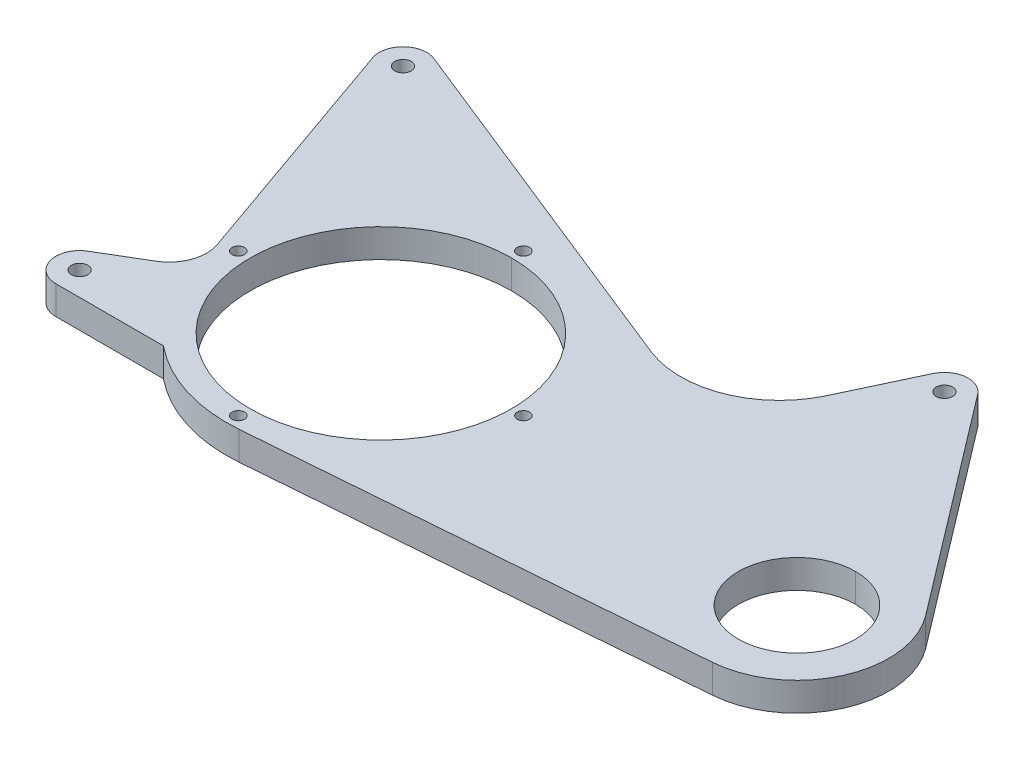
ISO-10303-21;
HEADER;
FILE_DESCRIPTION(('STEP AP214'),'2;1');
FILE_NAME('part.step','',(''),(''),'','','');
FILE_SCHEMA(('AUTOMOTIVE_DESIGN { 1 0 10303 214 1 1 1 1 }'));
ENDSEC;
DATA;
#1=APPLICATION_CONTEXT('core data for automotive mechanical design processes');
#2=APPLICATION_PROTOCOL_DEFINITION('international standard','automotive_design',2000,#1);
#3=PRODUCT_CONTEXT('',#1,'mechanical');
#4=PRODUCT('Part','Part','',(#3));
#5=PRODUCT_RELATED_PRODUCT_CATEGORY('part','',(#4));
#6=PRODUCT_DEFINITION_FORMATION('','',#4);
#7=PRODUCT_DEFINITION_CONTEXT('part definition',#1,'design');
#8=PRODUCT_DEFINITION('design','',#6,#7);
#9=PRODUCT_DEFINITION_SHAPE('','',#8);
#10=(LENGTH_UNIT() NAMED_UNIT(*) SI_UNIT(.MILLI.,.METRE.));
#11=(NAMED_UNIT(*) PLANE_ANGLE_UNIT() SI_UNIT($,.RADIAN.));
#12=(NAMED_UNIT(*) SI_UNIT($,.STERADIAN.) SOLID_ANGLE_UNIT());
#13=UNCERTAINTY_MEASURE_WITH_UNIT(LENGTH_MEASURE(1.E-05),#10,'distance_accuracy_value','');
#14=(GEOMETRIC_REPRESENTATION_CONTEXT(3) GLOBAL_UNCERTAINTY_ASSIGNED_CONTEXT((#13)) GLOBAL_UNIT_ASSIGNED_CONTEXT((#10,
#11,#12)) REPRESENTATION_CONTEXT('',''));
#15=CARTESIAN_POINT('',(0.,0.,0.));
#16=DIRECTION('',(0.,0.,1.));
#17=DIRECTION('',(1.,0.,0.));
#18=AXIS2_PLACEMENT_3D('',#15,#16,#17);
#19=CARTESIAN_POINT('',(54.6099999999999,11.43,127.));
#20=DIRECTION('',(0.,-1.,0.));
#21=DIRECTION('',(0.,0.,-1.));
#22=AXIS2_PLACEMENT_3D('',#19,#20,#21);
#23=CYLINDRICAL_SURFACE('',#22,23.5);
#24=CARTESIAN_POINT('',(54.6099999999999,11.43,127.));
#25=DIRECTION('',(0.,1.,0.));
#26=DIRECTION('',(0.,0.,1.));
#27=AXIS2_PLACEMENT_3D('',#24,#25,#26);
#28=CIRCLE('',#27,23.5);
#29=CARTESIAN_POINT('',(54.6099999999999,11.43,103.5));
#30=VERTEX_POINT('',#29);
#31=CARTESIAN_POINT('',(54.6099999999999,11.43,150.5));
#32=VERTEX_POINT('',#31);
#33=EDGE_CURVE('E205',#30,#32,#28,.T.);
#34=ORIENTED_EDGE('',*,*,#33,.T.);
#35=DIRECTION('',(0.,-1.,0.));
#36=VECTOR('',#35,1.);
#37=CARTESIAN_POINT('',(54.6099999999999,11.43,150.5));
#38=LINE('',#37,#36);
#39=CARTESIAN_POINT('',(54.6099999999999,0.,150.5));
#40=VERTEX_POINT('',#39);
#41=EDGE_CURVE('E11',#32,#40,#38,.T.);
#42=ORIENTED_EDGE('',*,*,#41,.T.);
#43=CARTESIAN_POINT('',(54.6099999999999,0.,127.));
#44=DIRECTION('',(0.,1.,0.));
#45=DIRECTION('',(0.,0.,1.));
#46=AXIS2_PLACEMENT_3D('',#43,#44,#45);
#47=CIRCLE('',#46,23.5);
#48=CARTESIAN_POINT('',(54.6099999999999,0.,103.5));
#49=VERTEX_POINT('',#48);
#50=EDGE_CURVE('E207',#49,#40,#47,.T.);
#51=ORIENTED_EDGE('',*,*,#50,.F.);
#52=DIRECTION('',(0.,1.,0.));
#53=VECTOR('',#52,1.);
#54=CARTESIAN_POINT('',(54.6099999999999,11.43,103.5));
#55=LINE('',#54,#53);
#56=EDGE_CURVE('E49',#49,#30,#55,.T.);
#57=ORIENTED_EDGE('',*,*,#56,.T.);
#58=EDGE_LOOP('',(#34,#42,#51,#57));
#59=FACE_BOUND('',#58,.T.);
#60=ADVANCED_FACE('F40',(#59),#23,.F.);
#61=CARTESIAN_POINT('',(-123.19,11.43,116.001477371938));
#62=DIRECTION('',(0.,-1.,0.));
#63=DIRECTION('',(0.,0.,-1.));
#64=AXIS2_PLACEMENT_3D('',#61,#62,#63);
#65=CYLINDRICAL_SURFACE('',#64,52.3875);
#66=CARTESIAN_POINT('',(-123.19,11.43,116.001477371938));
#67=DIRECTION('',(0.,1.,0.));
#68=DIRECTION('',(0.,0.,1.));
#69=AXIS2_PLACEMENT_3D('',#66,#67,#68);
#70=CIRCLE('',#69,52.3875);
#71=CARTESIAN_POINT('',(-123.19,11.43,63.6139773719377));
#72=VERTEX_POINT('',#71);
#73=CARTESIAN_POINT('',(-123.19,11.43,168.388977371938));
#74=VERTEX_POINT('',#73);
#75=EDGE_CURVE('E220',#72,#74,#70,.T.);
#76=ORIENTED_EDGE('',*,*,#75,.T.);
#77=DIRECTION('',(0.,-1.,0.));
#78=VECTOR('',#77,1.);
#79=CARTESIAN_POINT('',(-123.19,11.43,168.388977371938));
#80=LINE('',#79,#78);
#81=CARTESIAN_POINT('',(-123.19,0.,168.388977371938));
#82=VERTEX_POINT('',#81);
#83=EDGE_CURVE('E192',#74,#82,#80,.T.);
#84=ORIENTED_EDGE('',*,*,#83,.T.);
#85=CARTESIAN_POINT('',(-123.19,0.,116.001477371938));
#86=DIRECTION('',(0.,1.,0.));
#87=DIRECTION('',(0.,0.,1.));
#88=AXIS2_PLACEMENT_3D('',#85,#86,#87);
#89=CIRCLE('',#88,52.3875);
#90=CARTESIAN_POINT('',(-123.19,0.,63.6139773719377));
#91=VERTEX_POINT('',#90);
#92=EDGE_CURVE('E212',#91,#82,#89,.T.);
#93=ORIENTED_EDGE('',*,*,#92,.F.);
#94=DIRECTION('',(0.,1.,0.));
#95=VECTOR('',#94,1.);
#96=CARTESIAN_POINT('',(-123.19,11.43,63.6139773719377));
#97=LINE('',#96,#95);
#98=EDGE_CURVE('E188',#91,#72,#97,.T.);
#99=ORIENTED_EDGE('',*,*,#98,.T.);
#100=EDGE_LOOP('',(#76,#84,#93,#99));
#101=FACE_BOUND('',#100,.T.);
#102=ADVANCED_FACE('F338',(#101),#65,.F.);
#103=CARTESIAN_POINT('',(-205.575185514482,11.43,154.375359311032));
#104=DIRECTION('',(0.,1.,0.));
#105=DIRECTION('',(0.,0.,1.));
#106=AXIS2_PLACEMENT_3D('',#103,#104,#105);
#107=PLANE('',#106);
#108=CARTESIAN_POINT('',(-66.04,11.43,116.001477371938));
#109=DIRECTION('',(0.,-1.,0.));
#110=DIRECTION('',(0.,0.,-1.));
#111=AXIS2_PLACEMENT_3D('',#108,#109,#110);
#112=CIRCLE('',#111,2.5);
#113=CARTESIAN_POINT('',(-66.04,11.43,113.501477371938));
#114=VERTEX_POINT('',#113);
#115=EDGE_CURVE('E601',#114,#114,#112,.T.);
#116=ORIENTED_EDGE('',*,*,#115,.T.);
#117=EDGE_LOOP('',(#116));
#118=FACE_BOUND('',#117,.T.);
#119=ORIENTED_EDGE('',*,*,#33,.F.);
#120=EDGE_CURVE('E209',#32,#30,#28,.T.);
#121=ORIENTED_EDGE('',*,*,#120,.F.);
#122=EDGE_LOOP('',(#119,#121));
#123=FACE_BOUND('',#122,.T.);
#124=CARTESIAN_POINT('',(-205.575185514482,11.43,154.375359311032));
#125=DIRECTION('',(0.,1.,0.));
#126=DIRECTION('',(0.,0.,1.));
#127=AXIS2_PLACEMENT_3D('',#124,#125,#126);
#128=CIRCLE('',#127,9.52500000000005);
#129=CARTESIAN_POINT('',(-210.444169905688,11.43,146.188869465061));
#130=VERTEX_POINT('',#129);
#131=CARTESIAN_POINT('',(-205.575185514482,11.43,163.900359311032));
#132=VERTEX_POINT('',#131);
#133=EDGE_CURVE('E174',#130,#132,#128,.T.);
#134=ORIENTED_EDGE('',*,*,#133,.T.);
#135=DIRECTION('',(1.,0.,0.));
#136=VECTOR('',#135,1.);
#137=CARTESIAN_POINT('',(-205.575185514482,11.43,163.900359311032));
#138=LINE('',#137,#136);
#139=CARTESIAN_POINT('',(-162.418239384845,11.43,163.900359311032));
#140=VERTEX_POINT('',#139);
#141=EDGE_CURVE('E163',#132,#140,#138,.T.);
#142=ORIENTED_EDGE('',*,*,#141,.T.);
#143=CARTESIAN_POINT('',(-123.19,11.43,116.001477371937));
#144=DIRECTION('',(0.,1.,0.));
#145=DIRECTION('',(0.,0.,1.));
#146=AXIS2_PLACEMENT_3D('',#143,#144,#145);
#147=CIRCLE('',#146,61.912500000001);
#148=CARTESIAN_POINT('',(-118.273664056399,11.43,177.718470956684));
#149=VERTEX_POINT('',#148);
#150=EDGE_CURVE('E173',#140,#149,#147,.T.);
#151=ORIENTED_EDGE('',*,*,#150,.T.);
#152=DIRECTION('',(0.996842214169137,0.,-0.0794078084974861));
#153=VECTOR('',#152,1.);
#154=CARTESIAN_POINT('',(-118.273664056399,11.43,177.718470956684));
#155=LINE('',#154,#153);
#156=CARTESIAN_POINT('',(57.5345895869624,11.43,163.713698747849));
#157=VERTEX_POINT('',#156);
#158=EDGE_CURVE('E226',#149,#157,#155,.T.);
#159=ORIENTED_EDGE('',*,*,#158,.T.);
#160=CARTESIAN_POINT('',(54.6099999999999,11.43,127.));
#161=DIRECTION('',(0.,1.,0.));
#162=DIRECTION('',(0.,0.,1.));
#163=AXIS2_PLACEMENT_3D('',#160,#161,#162);
#164=CIRCLE('',#163,36.83);
#165=CARTESIAN_POINT('',(83.9187029811116,11.43,104.696439083299));
#166=VERTEX_POINT('',#165);
#167=EDGE_CURVE('E228',#157,#166,#164,.T.);
#168=ORIENTED_EDGE('',*,*,#167,.T.);
#169=DIRECTION('',(-0.605581344466488,0.,-0.795783409750518));
#170=VECTOR('',#169,1.);
#171=CARTESIAN_POINT('',(17.6135418446228,11.43,17.5660350584896));
#172=LINE('',#171,#170);
#173=CARTESIAN_POINT('',(17.6135418446228,11.43,17.5660350584896));
#174=VERTEX_POINT('',#173);
#175=EDGE_CURVE('E230',#166,#174,#172,.T.);
#176=ORIENTED_EDGE('',*,*,#175,.T.);
#177=CARTESIAN_POINT('',(10.0337048667491,11.43,23.3341973645329));
#178=DIRECTION('',(0.,1.,0.));
#179=DIRECTION('',(0.,0.,-1.));
#180=AXIS2_PLACEMENT_3D('',#177,#178,#179);
#181=CIRCLE('',#180,9.52500000000002);
#182=CARTESIAN_POINT('',(1.41255824520431,11.43,19.2843262641365));
#183=VERTEX_POINT('',#182);
#184=EDGE_CURVE('E232',#174,#183,#181,.T.);
#185=ORIENTED_EDGE('',*,*,#184,.T.);
#186=DIRECTION('',(-0.42518331762692,0.,0.905107256855101));
#187=VECTOR('',#186,1.);
#188=CARTESIAN_POINT('',(1.41255824520431,11.43,19.2843262641365));
#189=LINE('',#188,#187);
#190=CARTESIAN_POINT('',(-12.1766039892332,11.43,48.2122000612996));
#191=VERTEX_POINT('',#190);
#192=EDGE_CURVE('E234',#183,#191,#189,.T.);
#193=ORIENTED_EDGE('',*,*,#192,.T.);
#194=CARTESIAN_POINT('',(-48.0405739348598,11.43,31.3647362836502));
#195=DIRECTION('',(0.,-1.,0.));
#196=DIRECTION('',(0.,0.,-1.));
#197=AXIS2_PLACEMENT_3D('',#194,#195,#196);
#198=CIRCLE('',#197,39.6240000000003);
#199=CARTESIAN_POINT('',(-62.7807065141295,11.43,68.1450281197079));
#200=VERTEX_POINT('',#199);
#201=EDGE_CURVE('E236',#191,#200,#198,.T.);
#202=ORIENTED_EDGE('',*,*,#201,.T.);
#203=DIRECTION('',(-0.928232683122789,0.,-0.372000115568084));
#204=VECTOR('',#203,1.);
#205=CARTESIAN_POINT('',(-207.97488178539,11.43,9.95676243721548));
#206=LINE('',#205,#204);
#207=CARTESIAN_POINT('',(-207.97488178539,11.43,9.9567624372155));
#208=VERTEX_POINT('',#207);
#209=EDGE_CURVE('E238',#200,#208,#206,.T.);
#210=ORIENTED_EDGE('',*,*,#209,.T.);
#211=CARTESIAN_POINT('',(-211.518182886176,11.43,18.7981787439601));
#212=DIRECTION('',(0.,1.,0.));
#213=DIRECTION('',(0.,0.,-1.));
#214=AXIS2_PLACEMENT_3D('',#211,#212,#213);
#215=CIRCLE('',#214,9.52500000000002);
#216=CARTESIAN_POINT('',(-220.505862299566,11.43,21.9521038797442));
#217=VERTEX_POINT('',#216);
#218=EDGE_CURVE('E240',#208,#217,#215,.T.);
#219=ORIENTED_EDGE('',*,*,#218,.T.);
#220=DIRECTION('',(0.331120749163686,0.,0.943588389857187));
#221=VECTOR('',#220,1.);
#222=CARTESIAN_POINT('',(-220.505862299566,11.43,21.9521038797442));
#223=LINE('',#222,#221);
#224=CARTESIAN_POINT('',(-186.782347933203,11.43,118.053350031344));
#225=VERTEX_POINT('',#224);
#226=EDGE_CURVE('E242',#217,#225,#223,.T.);
#227=ORIENTED_EDGE('',*,*,#226,.T.);
#228=CARTESIAN_POINT('',(-200.998052664187,11.43,123.041875590805));
#229=DIRECTION('',(0.,-1.,0.));
#230=DIRECTION('',(0.,0.,1.));
#231=AXIS2_PLACEMENT_3D('',#228,#229,#230);
#232=CIRCLE('',#231,15.0655782582648);
#233=CARTESIAN_POINT('',(-193.296838450644,11.43,135.990348392376));
#234=VERTEX_POINT('',#233);
#235=EDGE_CURVE('E244',#225,#234,#232,.T.);
#236=ORIENTED_EDGE('',*,*,#235,.T.);
#237=DIRECTION('',(-0.859473999577012,0.,0.511179463643732));
#238=VECTOR('',#237,1.);
#239=CARTESIAN_POINT('',(-210.444169905688,11.43,146.188869465061));
#240=LINE('',#239,#238);
#241=EDGE_CURVE('E180',#234,#130,#240,.T.);
#242=ORIENTED_EDGE('',*,*,#241,.T.);
#243=EDGE_LOOP('',(#134,#142,#151,#159,#168,#176,#185,#193,#202,#210,#219,#227,#236,#242));
#244=FACE_BOUND('',#243,.T.);
#245=ORIENTED_EDGE('',*,*,#75,.F.);
#246=EDGE_CURVE('E222',#74,#72,#70,.T.);
#247=ORIENTED_EDGE('',*,*,#246,.F.);
#248=EDGE_LOOP('',(#245,#247));
#249=FACE_BOUND('',#248,.T.);
#250=CARTESIAN_POINT('',(-205.575185514482,11.43,154.375359311032));
#251=DIRECTION('',(0.,-1.,0.));
#252=DIRECTION('',(0.,0.,-1.));
#253=AXIS2_PLACEMENT_3D('',#250,#251,#252);
#254=CIRCLE('',#253,3.3);
#255=CARTESIAN_POINT('',(-205.575185514482,11.43,151.075359311032));
#256=VERTEX_POINT('',#255);
#257=EDGE_CURVE('E216',#256,#256,#254,.T.);
#258=ORIENTED_EDGE('',*,*,#257,.T.);
#259=EDGE_LOOP('',(#258));
#260=FACE_BOUND('',#259,.T.);
#261=CARTESIAN_POINT('',(-211.518182886176,11.43,18.79817874396));
#262=DIRECTION('',(0.,-1.,0.));
#263=DIRECTION('',(0.,0.,-1.));
#264=AXIS2_PLACEMENT_3D('',#261,#262,#263);
#265=CIRCLE('',#264,3.3);
#266=CARTESIAN_POINT('',(-211.518182886176,11.43,15.49817874396));
#267=VERTEX_POINT('',#266);
#268=EDGE_CURVE('E635',#267,#267,#265,.T.);
#269=ORIENTED_EDGE('',*,*,#268,.T.);
#270=EDGE_LOOP('',(#269));
#271=FACE_BOUND('',#270,.T.);
#272=CARTESIAN_POINT('',(10.0337048667491,11.43,23.3341973645329));
#273=DIRECTION('',(0.,-1.,0.));
#274=DIRECTION('',(0.,0.,-1.));
#275=AXIS2_PLACEMENT_3D('',#272,#273,#274);
#276=CIRCLE('',#275,3.29999999999999);
#277=CARTESIAN_POINT('',(10.0337048667491,11.43,20.0341973645329));
#278=VERTEX_POINT('',#277);
#279=EDGE_CURVE('E629',#278,#278,#276,.T.);
#280=ORIENTED_EDGE('',*,*,#279,.T.);
#281=EDGE_LOOP('',(#280));
#282=FACE_BOUND('',#281,.T.);
#283=CARTESIAN_POINT('',(-123.19,11.43,173.151477371938));
#284=DIRECTION('',(0.,-1.,0.));
#285=DIRECTION('',(0.,0.,-1.));
#286=AXIS2_PLACEMENT_3D('',#283,#284,#285);
#287=CIRCLE('',#286,2.5);
#288=CARTESIAN_POINT('',(-123.19,11.43,170.651477371938));
#289=VERTEX_POINT('',#288);
#290=EDGE_CURVE('E623',#289,#289,#287,.T.);
#291=ORIENTED_EDGE('',*,*,#290,.T.);
#292=EDGE_LOOP('',(#291));
#293=FACE_BOUND('',#292,.T.);
#294=CARTESIAN_POINT('',(-180.34,11.43,116.001477371938));
#295=DIRECTION('',(0.,-1.,0.));
#296=DIRECTION('',(0.,0.,-1.));
#297=AXIS2_PLACEMENT_3D('',#294,#295,#296);
#298=CIRCLE('',#297,2.5);
#299=CARTESIAN_POINT('',(-180.34,11.43,113.501477371938));
#300=VERTEX_POINT('',#299);
#301=EDGE_CURVE('E617',#300,#300,#298,.T.);
#302=ORIENTED_EDGE('',*,*,#301,.T.);
#303=EDGE_LOOP('',(#302));
#304=FACE_BOUND('',#303,.T.);
#305=CARTESIAN_POINT('',(-123.19,11.43,58.8514773719377));
#306=DIRECTION('',(0.,-1.,0.));
#307=DIRECTION('',(0.,0.,-1.));
#308=AXIS2_PLACEMENT_3D('',#305,#306,#307);
#309=CIRCLE('',#308,2.5);
#310=CARTESIAN_POINT('',(-123.19,11.43,56.3514773719377));
#311=VERTEX_POINT('',#310);
#312=EDGE_CURVE('E611',#311,#311,#309,.T.);
#313=ORIENTED_EDGE('',*,*,#312,.T.);
#314=EDGE_LOOP('',(#313));
#315=FACE_BOUND('',#314,.T.);
#316=ADVANCED_FACE('F177',(#118,#123,#244,#249,#260,#271,#282,#293,#304,#315),#107,.T.);
#317=CARTESIAN_POINT('',(-205.575185514482,0.,154.375359311032));
#318=DIRECTION('',(0.,1.,0.));
#319=DIRECTION('',(0.,0.,1.));
#320=AXIS2_PLACEMENT_3D('',#317,#318,#319);
#321=PLANE('',#320);
#322=CARTESIAN_POINT('',(-66.04,0.,116.001477371938));
#323=DIRECTION('',(0.,-1.,0.));
#324=DIRECTION('',(0.,0.,-1.));
#325=AXIS2_PLACEMENT_3D('',#322,#323,#324);
#326=CIRCLE('',#325,2.5);
#327=CARTESIAN_POINT('',(-66.04,0.,113.501477371938));
#328=VERTEX_POINT('',#327);
#329=EDGE_CURVE('E604',#328,#328,#326,.T.);
#330=ORIENTED_EDGE('',*,*,#329,.F.);
#331=EDGE_LOOP('',(#330));
#332=FACE_BOUND('',#331,.T.);
#333=CARTESIAN_POINT('',(-123.19,0.,58.8514773719377));
#334=DIRECTION('',(0.,-1.,0.));
#335=DIRECTION('',(0.,0.,-1.));
#336=AXIS2_PLACEMENT_3D('',#333,#334,#335);
#337=CIRCLE('',#336,2.5);
#338=CARTESIAN_POINT('',(-123.19,0.,56.3514773719377));
#339=VERTEX_POINT('',#338);
#340=EDGE_CURVE('E606',#339,#339,#337,.T.);
#341=ORIENTED_EDGE('',*,*,#340,.F.);
#342=EDGE_LOOP('',(#341));
#343=FACE_BOUND('',#342,.T.);
#344=CARTESIAN_POINT('',(-123.19,0.,173.151477371938));
#345=DIRECTION('',(0.,-1.,0.));
#346=DIRECTION('',(0.,0.,-1.));
#347=AXIS2_PLACEMENT_3D('',#344,#345,#346);
#348=CIRCLE('',#347,2.5);
#349=CARTESIAN_POINT('',(-123.19,0.,170.651477371938));
#350=VERTEX_POINT('',#349);
#351=EDGE_CURVE('E620',#350,#350,#348,.T.);
#352=ORIENTED_EDGE('',*,*,#351,.F.);
#353=EDGE_LOOP('',(#352));
#354=FACE_BOUND('',#353,.T.);
#355=CARTESIAN_POINT('',(10.0337048667491,0.,23.3341973645329));
#356=DIRECTION('',(0.,-1.,0.));
#357=DIRECTION('',(0.,0.,-1.));
#358=AXIS2_PLACEMENT_3D('',#355,#356,#357);
#359=CIRCLE('',#358,3.29999999999999);
#360=CARTESIAN_POINT('',(10.0337048667491,0.,20.0341973645329));
#361=VERTEX_POINT('',#360);
#362=EDGE_CURVE('E626',#361,#361,#359,.T.);
#363=ORIENTED_EDGE('',*,*,#362,.F.);
#364=EDGE_LOOP('',(#363));
#365=FACE_BOUND('',#364,.T.);
#366=CARTESIAN_POINT('',(-211.518182886176,0.,18.79817874396));
#367=DIRECTION('',(0.,-1.,0.));
#368=DIRECTION('',(0.,0.,-1.));
#369=AXIS2_PLACEMENT_3D('',#366,#367,#368);
#370=CIRCLE('',#369,3.3);
#371=CARTESIAN_POINT('',(-211.518182886176,0.,15.49817874396));
#372=VERTEX_POINT('',#371);
#373=EDGE_CURVE('E632',#372,#372,#370,.T.);
#374=ORIENTED_EDGE('',*,*,#373,.F.);
#375=EDGE_LOOP('',(#374));
#376=FACE_BOUND('',#375,.T.);
#377=CARTESIAN_POINT('',(-205.575185514482,0.,154.375359311032));
#378=DIRECTION('',(0.,-1.,0.));
#379=DIRECTION('',(0.,0.,-1.));
#380=AXIS2_PLACEMENT_3D('',#377,#378,#379);
#381=CIRCLE('',#380,3.3);
#382=CARTESIAN_POINT('',(-205.575185514482,0.,151.075359311032));
#383=VERTEX_POINT('',#382);
#384=EDGE_CURVE('E637',#383,#383,#381,.T.);
#385=ORIENTED_EDGE('',*,*,#384,.F.);
#386=EDGE_LOOP('',(#385));
#387=FACE_BOUND('',#386,.T.);
#388=CARTESIAN_POINT('',(-205.575185514482,0.,154.375359311032));
#389=DIRECTION('',(0.,1.,0.));
#390=DIRECTION('',(0.,0.,1.));
#391=AXIS2_PLACEMENT_3D('',#388,#389,#390);
#392=CIRCLE('',#391,9.52500000000005);
#393=CARTESIAN_POINT('',(-210.444169905688,0.,146.188869465061));
#394=VERTEX_POINT('',#393);
#395=CARTESIAN_POINT('',(-205.575185514482,0.,163.900359311032));
#396=VERTEX_POINT('',#395);
#397=EDGE_CURVE('E187',#394,#396,#392,.T.);
#398=ORIENTED_EDGE('',*,*,#397,.F.);
#399=DIRECTION('',(-0.859473999577012,0.,0.511179463643732));
#400=VECTOR('',#399,1.);
#401=CARTESIAN_POINT('',(-210.444169905688,0.,146.188869465061));
#402=LINE('',#401,#400);
#403=CARTESIAN_POINT('',(-193.296838450644,0.,135.990348392376));
#404=VERTEX_POINT('',#403);
#405=EDGE_CURVE('E184',#404,#394,#402,.T.);
#406=ORIENTED_EDGE('',*,*,#405,.F.);
#407=CARTESIAN_POINT('',(-200.998052664187,0.,123.041875590805));
#408=DIRECTION('',(0.,-1.,0.));
#409=DIRECTION('',(0.,0.,1.));
#410=AXIS2_PLACEMENT_3D('',#407,#408,#409);
#411=CIRCLE('',#410,15.0655782582648);
#412=CARTESIAN_POINT('',(-186.782347933203,0.,118.053350031344));
#413=VERTEX_POINT('',#412);
#414=EDGE_CURVE('E271',#413,#404,#411,.T.);
#415=ORIENTED_EDGE('',*,*,#414,.F.);
#416=DIRECTION('',(0.331120749163686,0.,0.943588389857187));
#417=VECTOR('',#416,1.);
#418=CARTESIAN_POINT('',(-220.505862299566,0.,21.9521038797442));
#419=LINE('',#418,#417);
#420=CARTESIAN_POINT('',(-220.505862299566,0.,21.9521038797442));
#421=VERTEX_POINT('',#420);
#422=EDGE_CURVE('E269',#421,#413,#419,.T.);
#423=ORIENTED_EDGE('',*,*,#422,.F.);
#424=CARTESIAN_POINT('',(-211.518182886176,0.,18.7981787439601));
#425=DIRECTION('',(0.,1.,0.));
#426=DIRECTION('',(0.,0.,-1.));
#427=AXIS2_PLACEMENT_3D('',#424,#425,#426);
#428=CIRCLE('',#427,9.52500000000002);
#429=CARTESIAN_POINT('',(-207.97488178539,0.,9.9567624372155));
#430=VERTEX_POINT('',#429);
#431=EDGE_CURVE('E267',#430,#421,#428,.T.);
#432=ORIENTED_EDGE('',*,*,#431,.F.);
#433=DIRECTION('',(-0.928232683122789,0.,-0.372000115568084));
#434=VECTOR('',#433,1.);
#435=CARTESIAN_POINT('',(-207.97488178539,0.,9.95676243721548));
#436=LINE('',#435,#434);
#437=CARTESIAN_POINT('',(-62.7807065141295,0.,68.1450281197079));
#438=VERTEX_POINT('',#437);
#439=EDGE_CURVE('E265',#438,#430,#436,.T.);
#440=ORIENTED_EDGE('',*,*,#439,.F.);
#441=CARTESIAN_POINT('',(-48.0405739348598,0.,31.3647362836502));
#442=DIRECTION('',(0.,-1.,0.));
#443=DIRECTION('',(0.,0.,-1.));
#444=AXIS2_PLACEMENT_3D('',#441,#442,#443);
#445=CIRCLE('',#444,39.6240000000003);
#446=CARTESIAN_POINT('',(-12.1766039892332,0.,48.2122000612996));
#447=VERTEX_POINT('',#446);
#448=EDGE_CURVE('E263',#447,#438,#445,.T.);
#449=ORIENTED_EDGE('',*,*,#448,.F.);
#450=DIRECTION('',(-0.42518331762692,0.,0.905107256855101));
#451=VECTOR('',#450,1.);
#452=CARTESIAN_POINT('',(1.41255824520431,0.,19.2843262641365));
#453=LINE('',#452,#451);
#454=CARTESIAN_POINT('',(1.41255824520431,0.,19.2843262641365));
#455=VERTEX_POINT('',#454);
#456=EDGE_CURVE('E261',#455,#447,#453,.T.);
#457=ORIENTED_EDGE('',*,*,#456,.F.);
#458=CARTESIAN_POINT('',(10.0337048667491,0.,23.3341973645329));
#459=DIRECTION('',(0.,1.,0.));
#460=DIRECTION('',(0.,0.,-1.));
#461=AXIS2_PLACEMENT_3D('',#458,#459,#460);
#462=CIRCLE('',#461,9.52500000000002);
#463=CARTESIAN_POINT('',(17.6135418446228,0.,17.5660350584896));
#464=VERTEX_POINT('',#463);
#465=EDGE_CURVE('E259',#464,#455,#462,.T.);
#466=ORIENTED_EDGE('',*,*,#465,.F.);
#467=DIRECTION('',(-0.605581344466488,0.,-0.795783409750518));
#468=VECTOR('',#467,1.);
#469=CARTESIAN_POINT('',(17.6135418446228,0.,17.5660350584896));
#470=LINE('',#469,#468);
#471=CARTESIAN_POINT('',(83.9187029811116,0.,104.696439083299));
#472=VERTEX_POINT('',#471);
#473=EDGE_CURVE('E257',#472,#464,#470,.T.);
#474=ORIENTED_EDGE('',*,*,#473,.F.);
#475=CARTESIAN_POINT('',(54.6099999999999,0.,127.));
#476=DIRECTION('',(0.,1.,0.));
#477=DIRECTION('',(0.,0.,1.));
#478=AXIS2_PLACEMENT_3D('',#475,#476,#477);
#479=CIRCLE('',#478,36.83);
#480=CARTESIAN_POINT('',(57.5345895869624,0.,163.713698747849));
#481=VERTEX_POINT('',#480);
#482=EDGE_CURVE('E255',#481,#472,#479,.T.);
#483=ORIENTED_EDGE('',*,*,#482,.F.);
#484=DIRECTION('',(0.996842214169137,0.,-0.0794078084974861));
#485=VECTOR('',#484,1.);
#486=CARTESIAN_POINT('',(-118.273664056399,0.,177.718470956684));
#487=LINE('',#486,#485);
#488=CARTESIAN_POINT('',(-118.273664056399,0.,177.718470956684));
#489=VERTEX_POINT('',#488);
#490=EDGE_CURVE('E253',#489,#481,#487,.T.);
#491=ORIENTED_EDGE('',*,*,#490,.F.);
#492=CARTESIAN_POINT('',(-123.19,0.,116.001477371937));
#493=DIRECTION('',(0.,1.,0.));
#494=DIRECTION('',(0.,0.,1.));
#495=AXIS2_PLACEMENT_3D('',#492,#493,#494);
#496=CIRCLE('',#495,61.912500000001);
#497=CARTESIAN_POINT('',(-162.418239384845,0.,163.900359311032));
#498=VERTEX_POINT('',#497);
#499=EDGE_CURVE('E251',#498,#489,#496,.T.);
#500=ORIENTED_EDGE('',*,*,#499,.F.);
#501=DIRECTION('',(1.,0.,0.));
#502=VECTOR('',#501,1.);
#503=CARTESIAN_POINT('',(-205.575185514482,0.,163.900359311032));
#504=LINE('',#503,#502);
#505=EDGE_CURVE('E249',#396,#498,#504,.T.);
#506=ORIENTED_EDGE('',*,*,#505,.F.);
#507=EDGE_LOOP('',(#398,#406,#415,#423,#432,#440,#449,#457,#466,#474,#483,#491,#500,#506));
#508=FACE_BOUND('',#507,.T.);
#509=ORIENTED_EDGE('',*,*,#92,.T.);
#510=EDGE_CURVE('E210',#82,#91,#89,.T.);
#511=ORIENTED_EDGE('',*,*,#510,.T.);
#512=EDGE_LOOP('',(#509,#511));
#513=FACE_BOUND('',#512,.T.);
#514=ORIENTED_EDGE('',*,*,#50,.T.);
#515=EDGE_CURVE('E219',#40,#49,#47,.T.);
#516=ORIENTED_EDGE('',*,*,#515,.T.);
#517=EDGE_LOOP('',(#514,#516));
#518=FACE_BOUND('',#517,.T.);
#519=CARTESIAN_POINT('',(-180.34,0.,116.001477371938));
#520=DIRECTION('',(0.,-1.,0.));
#521=DIRECTION('',(0.,0.,-1.));
#522=AXIS2_PLACEMENT_3D('',#519,#520,#521);
#523=CIRCLE('',#522,2.5);
#524=CARTESIAN_POINT('',(-180.34,0.,113.501477371938));
#525=VERTEX_POINT('',#524);
#526=EDGE_CURVE('E614',#525,#525,#523,.T.);
#527=ORIENTED_EDGE('',*,*,#526,.F.);
#528=EDGE_LOOP('',(#527));
#529=FACE_BOUND('',#528,.T.);
#530=ADVANCED_FACE('F315',(#332,#343,#354,#365,#376,#387,#508,#513,#518,#529),#321,.F.);
#531=CARTESIAN_POINT('',(-205.575185514482,11.43,154.375359311032));
#532=DIRECTION('',(0.,-1.,0.));
#533=DIRECTION('',(0.,0.,-1.));
#534=AXIS2_PLACEMENT_3D('',#531,#532,#533);
#535=CYLINDRICAL_SURFACE('',#534,9.52500000000005);
#536=ORIENTED_EDGE('',*,*,#397,.T.);
#537=DIRECTION('',(0.,-1.,0.));
#538=VECTOR('',#537,1.);
#539=CARTESIAN_POINT('',(-205.575185514482,11.43,163.900359311032));
#540=LINE('',#539,#538);
#541=EDGE_CURVE('E167',#132,#396,#540,.T.);
#542=ORIENTED_EDGE('',*,*,#541,.F.);
#543=ORIENTED_EDGE('',*,*,#133,.F.);
#544=DIRECTION('',(0.,-1.,0.));
#545=VECTOR('',#544,1.);
#546=CARTESIAN_POINT('',(-210.444169905688,11.43,146.188869465061));
#547=LINE('',#546,#545);
#548=EDGE_CURVE('E247',#130,#394,#547,.T.);
#549=ORIENTED_EDGE('',*,*,#548,.T.);
#550=EDGE_LOOP('',(#536,#542,#543,#549));
#551=FACE_BOUND('',#550,.T.);
#552=ADVANCED_FACE('F42',(#551),#535,.T.);
#553=CARTESIAN_POINT('',(-205.575185514482,11.43,163.900359311032));
#554=DIRECTION('',(0.,0.,-1.));
#555=DIRECTION('',(-1.,0.,0.));
#556=AXIS2_PLACEMENT_3D('',#553,#554,#555);
#557=PLANE('',#556);
#558=ORIENTED_EDGE('',*,*,#505,.T.);
#559=DIRECTION('',(0.,-1.,0.));
#560=VECTOR('',#559,1.);
#561=CARTESIAN_POINT('',(-162.418239384845,11.43,163.900359311032));
#562=LINE('',#561,#560);
#563=EDGE_CURVE('E170',#140,#498,#562,.T.);
#564=ORIENTED_EDGE('',*,*,#563,.F.);
#565=ORIENTED_EDGE('',*,*,#141,.F.);
#566=ORIENTED_EDGE('',*,*,#541,.T.);
#567=EDGE_LOOP('',(#558,#564,#565,#566));
#568=FACE_BOUND('',#567,.T.);
#569=ADVANCED_FACE('F165',(#568),#557,.F.);
#570=CARTESIAN_POINT('',(-123.19,11.43,116.001477371937));
#571=DIRECTION('',(0.,-1.,0.));
#572=DIRECTION('',(0.,0.,-1.));
#573=AXIS2_PLACEMENT_3D('',#570,#571,#572);
#574=CYLINDRICAL_SURFACE('',#573,61.912500000001);
#575=ORIENTED_EDGE('',*,*,#499,.T.);
#576=DIRECTION('',(0.,-1.,0.));
#577=VECTOR('',#576,1.);
#578=CARTESIAN_POINT('',(-118.273664056399,11.43,177.718470956684));
#579=LINE('',#578,#577);
#580=EDGE_CURVE('E194',#149,#489,#579,.T.);
#581=ORIENTED_EDGE('',*,*,#580,.F.);
#582=ORIENTED_EDGE('',*,*,#150,.F.);
#583=ORIENTED_EDGE('',*,*,#563,.T.);
#584=EDGE_LOOP('',(#575,#581,#582,#583));
#585=FACE_BOUND('',#584,.T.);
#586=ADVANCED_FACE('F329',(#585),#574,.T.);
#587=CARTESIAN_POINT('',(-118.273664056399,11.43,177.718470956684));
#588=DIRECTION('',(-0.0794078084974861,0.,-0.996842214169137));
#589=DIRECTION('',(-0.996842214169137,0.,0.0794078084974861));
#590=AXIS2_PLACEMENT_3D('',#587,#588,#589);
#591=PLANE('',#590);
#592=ORIENTED_EDGE('',*,*,#490,.T.);
#593=DIRECTION('',(0.,-1.,0.));
#594=VECTOR('',#593,1.);
#595=CARTESIAN_POINT('',(57.5345895869624,11.43,163.713698747849));
#596=LINE('',#595,#594);
#597=EDGE_CURVE('E302',#157,#481,#596,.T.);
#598=ORIENTED_EDGE('',*,*,#597,.F.);
#599=ORIENTED_EDGE('',*,*,#158,.F.);
#600=ORIENTED_EDGE('',*,*,#580,.T.);
#601=EDGE_LOOP('',(#592,#598,#599,#600));
#602=FACE_BOUND('',#601,.T.);
#603=ADVANCED_FACE('F309',(#602),#591,.F.);
#604=CARTESIAN_POINT('',(54.6099999999999,11.43,127.));
#605=DIRECTION('',(0.,-1.,0.));
#606=DIRECTION('',(0.,0.,-1.));
#607=AXIS2_PLACEMENT_3D('',#604,#605,#606);
#608=CYLINDRICAL_SURFACE('',#607,36.83);
#609=ORIENTED_EDGE('',*,*,#482,.T.);
#610=DIRECTION('',(0.,-1.,0.));
#611=VECTOR('',#610,1.);
#612=CARTESIAN_POINT('',(83.9187029811116,11.43,104.696439083299));
#613=LINE('',#612,#611);
#614=EDGE_CURVE('E299',#166,#472,#613,.T.);
#615=ORIENTED_EDGE('',*,*,#614,.F.);
#616=ORIENTED_EDGE('',*,*,#167,.F.);
#617=ORIENTED_EDGE('',*,*,#597,.T.);
#618=EDGE_LOOP('',(#609,#615,#616,#617));
#619=FACE_BOUND('',#618,.T.);
#620=ADVANCED_FACE('F321',(#619),#608,.T.);
#621=CARTESIAN_POINT('',(17.6135418446228,11.43,17.5660350584896));
#622=DIRECTION('',(-0.795783409750518,0.,0.605581344466488));
#623=DIRECTION('',(0.605581344466488,0.,0.795783409750518));
#624=AXIS2_PLACEMENT_3D('',#621,#622,#623);
#625=PLANE('',#624);
#626=ORIENTED_EDGE('',*,*,#473,.T.);
#627=DIRECTION('',(0.,-1.,0.));
#628=VECTOR('',#627,1.);
#629=CARTESIAN_POINT('',(17.6135418446228,11.43,17.5660350584896));
#630=LINE('',#629,#628);
#631=EDGE_CURVE('E296',#174,#464,#630,.T.);
#632=ORIENTED_EDGE('',*,*,#631,.F.);
#633=ORIENTED_EDGE('',*,*,#175,.F.);
#634=ORIENTED_EDGE('',*,*,#614,.T.);
#635=EDGE_LOOP('',(#626,#632,#633,#634));
#636=FACE_BOUND('',#635,.T.);
#637=ADVANCED_FACE('F325',(#636),#625,.F.);
#638=CARTESIAN_POINT('',(10.0337048667491,11.43,23.3341973645329));
#639=DIRECTION('',(0.,-1.,0.));
#640=DIRECTION('',(0.,0.,-1.));
#641=AXIS2_PLACEMENT_3D('',#638,#639,#640);
#642=CYLINDRICAL_SURFACE('',#641,9.52500000000002);
#643=ORIENTED_EDGE('',*,*,#465,.T.);
#644=DIRECTION('',(0.,-1.,0.));
#645=VECTOR('',#644,1.);
#646=CARTESIAN_POINT('',(1.41255824520431,11.43,19.2843262641365));
#647=LINE('',#646,#645);
#648=EDGE_CURVE('E293',#183,#455,#647,.T.);
#649=ORIENTED_EDGE('',*,*,#648,.F.);
#650=ORIENTED_EDGE('',*,*,#184,.F.);
#651=ORIENTED_EDGE('',*,*,#631,.T.);
#652=EDGE_LOOP('',(#643,#649,#650,#651));
#653=FACE_BOUND('',#652,.T.);
#654=ADVANCED_FACE('F393',(#653),#642,.T.);
#655=CARTESIAN_POINT('',(1.41255824520431,11.43,19.2843262641365));
#656=DIRECTION('',(0.905107256855101,0.,0.42518331762692));
#657=DIRECTION('',(0.42518331762692,0.,-0.905107256855101));
#658=AXIS2_PLACEMENT_3D('',#655,#656,#657);
#659=PLANE('',#658);
#660=ORIENTED_EDGE('',*,*,#456,.T.);
#661=DIRECTION('',(0.,-1.,0.));
#662=VECTOR('',#661,1.);
#663=CARTESIAN_POINT('',(-12.1766039892332,11.43,48.2122000612996));
#664=LINE('',#663,#662);
#665=EDGE_CURVE('E290',#191,#447,#664,.T.);
#666=ORIENTED_EDGE('',*,*,#665,.F.);
#667=ORIENTED_EDGE('',*,*,#192,.F.);
#668=ORIENTED_EDGE('',*,*,#648,.T.);
#669=EDGE_LOOP('',(#660,#666,#667,#668));
#670=FACE_BOUND('',#669,.T.);
#671=ADVANCED_FACE('F389',(#670),#659,.F.);
#672=CARTESIAN_POINT('',(-48.0405739348598,11.43,31.3647362836502));
#673=DIRECTION('',(0.,-1.,0.));
#674=DIRECTION('',(0.,0.,-1.));
#675=AXIS2_PLACEMENT_3D('',#672,#673,#674);
#676=CYLINDRICAL_SURFACE('',#675,39.6240000000003);
#677=ORIENTED_EDGE('',*,*,#448,.T.);
#678=DIRECTION('',(0.,-1.,0.));
#679=VECTOR('',#678,1.);
#680=CARTESIAN_POINT('',(-62.7807065141295,11.43,68.1450281197079));
#681=LINE('',#680,#679);
#682=EDGE_CURVE('E287',#200,#438,#681,.T.);
#683=ORIENTED_EDGE('',*,*,#682,.F.);
#684=ORIENTED_EDGE('',*,*,#201,.F.);
#685=ORIENTED_EDGE('',*,*,#665,.T.);
#686=EDGE_LOOP('',(#677,#683,#684,#685));
#687=FACE_BOUND('',#686,.T.);
#688=ADVANCED_FACE('F385',(#687),#676,.F.);
#689=CARTESIAN_POINT('',(-207.97488178539,11.43,9.95676243721548));
#690=DIRECTION('',(-0.372000115568084,0.,0.928232683122789));
#691=DIRECTION('',(0.928232683122789,0.,0.372000115568084));
#692=AXIS2_PLACEMENT_3D('',#689,#690,#691);
#693=PLANE('',#692);
#694=ORIENTED_EDGE('',*,*,#439,.T.);
#695=DIRECTION('',(0.,-1.,0.));
#696=VECTOR('',#695,1.);
#697=CARTESIAN_POINT('',(-207.97488178539,11.43,9.9567624372155));
#698=LINE('',#697,#696);
#699=EDGE_CURVE('E284',#208,#430,#698,.T.);
#700=ORIENTED_EDGE('',*,*,#699,.F.);
#701=ORIENTED_EDGE('',*,*,#209,.F.);
#702=ORIENTED_EDGE('',*,*,#682,.T.);
#703=EDGE_LOOP('',(#694,#700,#701,#702));
#704=FACE_BOUND('',#703,.T.);
#705=ADVANCED_FACE('F381',(#704),#693,.F.);
#706=CARTESIAN_POINT('',(-211.518182886176,11.43,18.7981787439601));
#707=DIRECTION('',(0.,-1.,0.));
#708=DIRECTION('',(0.,0.,-1.));
#709=AXIS2_PLACEMENT_3D('',#706,#707,#708);
#710=CYLINDRICAL_SURFACE('',#709,9.52500000000002);
#711=ORIENTED_EDGE('',*,*,#431,.T.);
#712=DIRECTION('',(0.,-1.,0.));
#713=VECTOR('',#712,1.);
#714=CARTESIAN_POINT('',(-220.505862299566,11.43,21.9521038797442));
#715=LINE('',#714,#713);
#716=EDGE_CURVE('E281',#217,#421,#715,.T.);
#717=ORIENTED_EDGE('',*,*,#716,.F.);
#718=ORIENTED_EDGE('',*,*,#218,.F.);
#719=ORIENTED_EDGE('',*,*,#699,.T.);
#720=EDGE_LOOP('',(#711,#717,#718,#719));
#721=FACE_BOUND('',#720,.T.);
#722=ADVANCED_FACE('F377',(#721),#710,.T.);
#723=CARTESIAN_POINT('',(-220.505862299566,11.43,21.9521038797442));
#724=DIRECTION('',(0.943588389857187,0.,-0.331120749163686));
#725=DIRECTION('',(-0.331120749163686,0.,-0.943588389857187));
#726=AXIS2_PLACEMENT_3D('',#723,#724,#725);
#727=PLANE('',#726);
#728=ORIENTED_EDGE('',*,*,#422,.T.);
#729=DIRECTION('',(0.,-1.,0.));
#730=VECTOR('',#729,1.);
#731=CARTESIAN_POINT('',(-186.782347933203,11.43,118.053350031344));
#732=LINE('',#731,#730);
#733=EDGE_CURVE('E278',#225,#413,#732,.T.);
#734=ORIENTED_EDGE('',*,*,#733,.F.);
#735=ORIENTED_EDGE('',*,*,#226,.F.);
#736=ORIENTED_EDGE('',*,*,#716,.T.);
#737=EDGE_LOOP('',(#728,#734,#735,#736));
#738=FACE_BOUND('',#737,.T.);
#739=ADVANCED_FACE('F373',(#738),#727,.F.);
#740=CARTESIAN_POINT('',(-200.998052664187,11.43,123.041875590805));
#741=DIRECTION('',(0.,-1.,0.));
#742=DIRECTION('',(0.,0.,-1.));
#743=AXIS2_PLACEMENT_3D('',#740,#741,#742);
#744=CYLINDRICAL_SURFACE('',#743,15.0655782582648);
#745=ORIENTED_EDGE('',*,*,#414,.T.);
#746=DIRECTION('',(0.,-1.,0.));
#747=VECTOR('',#746,1.);
#748=CARTESIAN_POINT('',(-193.296838450644,11.43,135.990348392376));
#749=LINE('',#748,#747);
#750=EDGE_CURVE('E275',#234,#404,#749,.T.);
#751=ORIENTED_EDGE('',*,*,#750,.F.);
#752=ORIENTED_EDGE('',*,*,#235,.F.);
#753=ORIENTED_EDGE('',*,*,#733,.T.);
#754=EDGE_LOOP('',(#745,#751,#752,#753));
#755=FACE_BOUND('',#754,.T.);
#756=ADVANCED_FACE('F361',(#755),#744,.F.);
#757=CARTESIAN_POINT('',(-210.444169905688,11.43,146.188869465061));
#758=DIRECTION('',(0.511179463643732,0.,0.859473999577012));
#759=DIRECTION('',(0.859473999577013,0.,-0.511179463643732));
#760=AXIS2_PLACEMENT_3D('',#757,#758,#759);
#761=PLANE('',#760);
#762=ORIENTED_EDGE('',*,*,#405,.T.);
#763=ORIENTED_EDGE('',*,*,#548,.F.);
#764=ORIENTED_EDGE('',*,*,#241,.F.);
#765=ORIENTED_EDGE('',*,*,#750,.T.);
#766=EDGE_LOOP('',(#762,#763,#764,#765));
#767=FACE_BOUND('',#766,.T.);
#768=ADVANCED_FACE('F356',(#767),#761,.F.);
#769=ORIENTED_EDGE('',*,*,#83,.F.);
#770=ORIENTED_EDGE('',*,*,#246,.T.);
#771=ORIENTED_EDGE('',*,*,#98,.F.);
#772=ORIENTED_EDGE('',*,*,#510,.F.);
#773=EDGE_LOOP('',(#769,#770,#771,#772));
#774=FACE_BOUND('',#773,.T.);
#775=ADVANCED_FACE('F346',(#774),#65,.F.);
#776=ORIENTED_EDGE('',*,*,#41,.F.);
#777=ORIENTED_EDGE('',*,*,#120,.T.);
#778=ORIENTED_EDGE('',*,*,#56,.F.);
#779=ORIENTED_EDGE('',*,*,#515,.F.);
#780=EDGE_LOOP('',(#776,#777,#778,#779));
#781=FACE_BOUND('',#780,.T.);
#782=ADVANCED_FACE('F340',(#781),#23,.F.);
#783=CARTESIAN_POINT('',(-205.575185514482,0.,154.375359311032));
#784=DIRECTION('',(0.,-1.,0.));
#785=DIRECTION('',(0.,0.,-1.));
#786=AXIS2_PLACEMENT_3D('',#783,#784,#785);
#787=CYLINDRICAL_SURFACE('',#786,3.3);
#788=ORIENTED_EDGE('',*,*,#257,.F.);
#789=EDGE_LOOP('',(#788));
#790=FACE_BOUND('',#789,.T.);
#791=ORIENTED_EDGE('',*,*,#384,.T.);
#792=EDGE_LOOP('',(#791));
#793=FACE_BOUND('',#792,.T.);
#794=ADVANCED_FACE('F349',(#790,#793),#787,.F.);
#795=CARTESIAN_POINT('',(-211.518182886176,0.,18.79817874396));
#796=DIRECTION('',(0.,-1.,0.));
#797=DIRECTION('',(0.,0.,-1.));
#798=AXIS2_PLACEMENT_3D('',#795,#796,#797);
#799=CYLINDRICAL_SURFACE('',#798,3.3);
#800=ORIENTED_EDGE('',*,*,#268,.F.);
#801=EDGE_LOOP('',(#800));
#802=FACE_BOUND('',#801,.T.);
#803=ORIENTED_EDGE('',*,*,#373,.T.);
#804=EDGE_LOOP('',(#803));
#805=FACE_BOUND('',#804,.T.);
#806=ADVANCED_FACE('F354',(#802,#805),#799,.F.);
#807=CARTESIAN_POINT('',(10.0337048667491,0.,23.3341973645329));
#808=DIRECTION('',(0.,-1.,0.));
#809=DIRECTION('',(0.,0.,-1.));
#810=AXIS2_PLACEMENT_3D('',#807,#808,#809);
#811=CYLINDRICAL_SURFACE('',#810,3.29999999999999);
#812=ORIENTED_EDGE('',*,*,#279,.F.);
#813=EDGE_LOOP('',(#812));
#814=FACE_BOUND('',#813,.T.);
#815=ORIENTED_EDGE('',*,*,#362,.T.);
#816=EDGE_LOOP('',(#815));
#817=FACE_BOUND('',#816,.T.);
#818=ADVANCED_FACE('F456',(#814,#817),#811,.F.);
#819=CARTESIAN_POINT('',(-123.19,0.,173.151477371938));
#820=DIRECTION('',(0.,-1.,0.));
#821=DIRECTION('',(0.,0.,-1.));
#822=AXIS2_PLACEMENT_3D('',#819,#820,#821);
#823=CYLINDRICAL_SURFACE('',#822,2.5);
#824=ORIENTED_EDGE('',*,*,#290,.F.);
#825=EDGE_LOOP('',(#824));
#826=FACE_BOUND('',#825,.T.);
#827=ORIENTED_EDGE('',*,*,#351,.T.);
#828=EDGE_LOOP('',(#827));
#829=FACE_BOUND('',#828,.T.);
#830=ADVANCED_FACE('F466',(#826,#829),#823,.F.);
#831=CARTESIAN_POINT('',(-180.34,0.,116.001477371938));
#832=DIRECTION('',(0.,-1.,0.));
#833=DIRECTION('',(0.,0.,-1.));
#834=AXIS2_PLACEMENT_3D('',#831,#832,#833);
#835=CYLINDRICAL_SURFACE('',#834,2.5);
#836=ORIENTED_EDGE('',*,*,#301,.F.);
#837=EDGE_LOOP('',(#836));
#838=FACE_BOUND('',#837,.T.);
#839=ORIENTED_EDGE('',*,*,#526,.T.);
#840=EDGE_LOOP('',(#839));
#841=FACE_BOUND('',#840,.T.);
#842=ADVANCED_FACE('F476',(#838,#841),#835,.F.);
#843=CARTESIAN_POINT('',(-123.19,0.,58.8514773719377));
#844=DIRECTION('',(0.,-1.,0.));
#845=DIRECTION('',(0.,0.,-1.));
#846=AXIS2_PLACEMENT_3D('',#843,#844,#845);
#847=CYLINDRICAL_SURFACE('',#846,2.5);
#848=ORIENTED_EDGE('',*,*,#312,.F.);
#849=EDGE_LOOP('',(#848));
#850=FACE_BOUND('',#849,.T.);
#851=ORIENTED_EDGE('',*,*,#340,.T.);
#852=EDGE_LOOP('',(#851));
#853=FACE_BOUND('',#852,.T.);
#854=ADVANCED_FACE('F488',(#850,#853),#847,.F.);
#855=CARTESIAN_POINT('',(-66.04,0.,116.001477371938));
#856=DIRECTION('',(0.,-1.,0.));
#857=DIRECTION('',(0.,0.,-1.));
#858=AXIS2_PLACEMENT_3D('',#855,#856,#857);
#859=CYLINDRICAL_SURFACE('',#858,2.5);
#860=ORIENTED_EDGE('',*,*,#115,.F.);
#861=EDGE_LOOP('',(#860));
#862=FACE_BOUND('',#861,.T.);
#863=ORIENTED_EDGE('',*,*,#329,.T.);
#864=EDGE_LOOP('',(#863));
#865=FACE_BOUND('',#864,.T.);
#866=ADVANCED_FACE('F501',(#862,#865),#859,.F.);
#867=CLOSED_SHELL('',(#60,#102,#316,#530,#552,#569,#586,#603,#620,#637,#654,#671,#688,#705,#722,
#739,#756,#768,#775,#782,#794,#806,#818,#830,#842,#854,#866));
#868=MANIFOLD_SOLID_BREP('B2',#867);
#869=ADVANCED_BREP_SHAPE_REPRESENTATION('',(#18,#868),#14);
#870=SHAPE_DEFINITION_REPRESENTATION(#9,#869);
ENDSEC;
END-ISO-10303-21;
